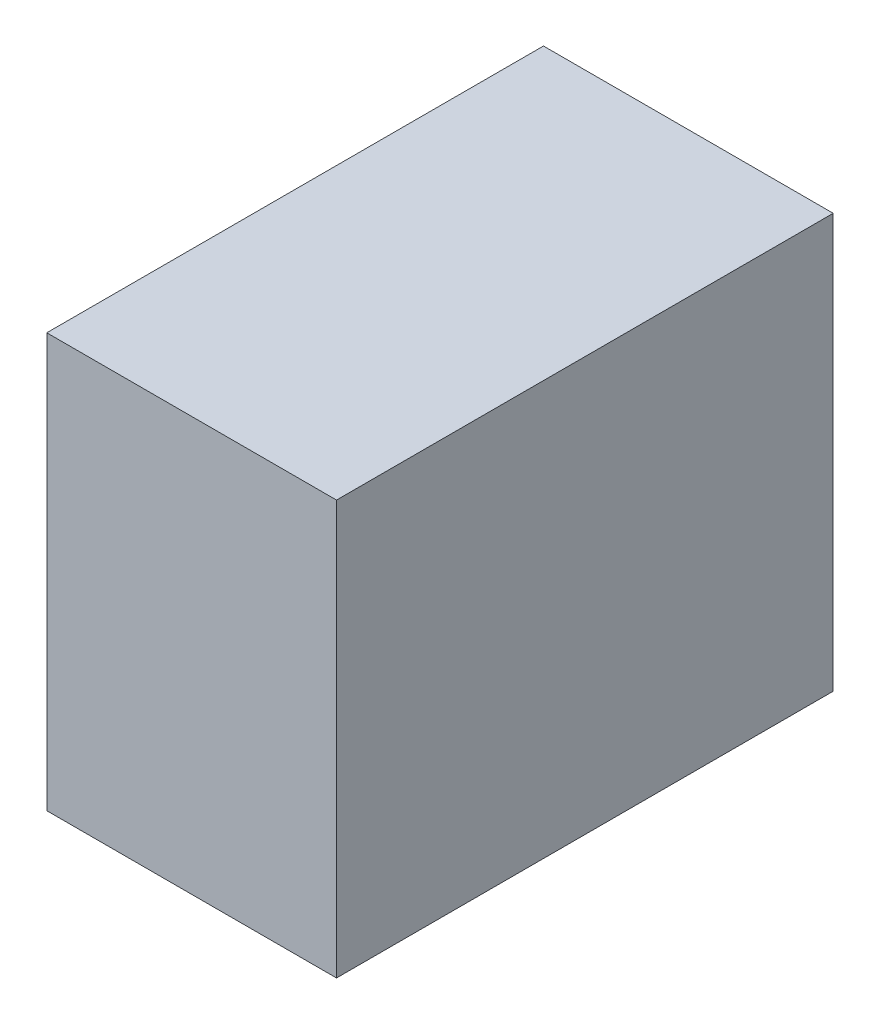
ISO-10303-21;
HEADER;
FILE_DESCRIPTION(('STEP AP214'),'2;1');
FILE_NAME('part.step','',(''),(''),'','','');
FILE_SCHEMA(('AUTOMOTIVE_DESIGN { 1 0 10303 214 1 1 1 1 }'));
ENDSEC;
DATA;
#1=APPLICATION_CONTEXT('core data for automotive mechanical design processes');
#2=APPLICATION_PROTOCOL_DEFINITION('international standard','automotive_design',2000,#1);
#3=PRODUCT_CONTEXT('',#1,'mechanical');
#4=PRODUCT('Part','Part','',(#3));
#5=PRODUCT_RELATED_PRODUCT_CATEGORY('part','',(#4));
#6=PRODUCT_DEFINITION_FORMATION('','',#4);
#7=PRODUCT_DEFINITION_CONTEXT('part definition',#1,'design');
#8=PRODUCT_DEFINITION('design','',#6,#7);
#9=PRODUCT_DEFINITION_SHAPE('','',#8);
#10=(LENGTH_UNIT() NAMED_UNIT(*) SI_UNIT(.MILLI.,.METRE.));
#11=(NAMED_UNIT(*) PLANE_ANGLE_UNIT() SI_UNIT($,.RADIAN.));
#12=(NAMED_UNIT(*) SI_UNIT($,.STERADIAN.) SOLID_ANGLE_UNIT());
#13=UNCERTAINTY_MEASURE_WITH_UNIT(LENGTH_MEASURE(1.E-05),#10,'distance_accuracy_value','');
#14=(GEOMETRIC_REPRESENTATION_CONTEXT(3) GLOBAL_UNCERTAINTY_ASSIGNED_CONTEXT((#13)) GLOBAL_UNIT_ASSIGNED_CONTEXT((#10,
#11,#12)) REPRESENTATION_CONTEXT('',''));
#15=CARTESIAN_POINT('',(0.,0.,0.));
#16=DIRECTION('',(0.,0.,1.));
#17=DIRECTION('',(1.,0.,0.));
#18=AXIS2_PLACEMENT_3D('',#15,#16,#17);
#19=CARTESIAN_POINT('',(-88.9,-127.,304.8));
#20=DIRECTION('',(1.,0.,0.));
#21=DIRECTION('',(0.,0.,-1.));
#22=AXIS2_PLACEMENT_3D('',#19,#20,#21);
#23=PLANE('',#22);
#24=DIRECTION('',(0.,-1.,0.));
#25=VECTOR('',#24,1.);
#26=CARTESIAN_POINT('',(-88.9,-127.,0.));
#27=LINE('',#26,#25);
#28=CARTESIAN_POINT('',(-88.9,127.,0.));
#29=VERTEX_POINT('',#28);
#30=CARTESIAN_POINT('',(-88.9,-127.,0.));
#31=VERTEX_POINT('',#30);
#32=EDGE_CURVE('E113',#29,#31,#27,.T.);
#33=ORIENTED_EDGE('',*,*,#32,.T.);
#34=DIRECTION('',(0.,0.,-1.));
#35=VECTOR('',#34,1.);
#36=CARTESIAN_POINT('',(-88.9,-127.,304.8));
#37=LINE('',#36,#35);
#38=CARTESIAN_POINT('',(-88.9,-127.,304.8));
#39=VERTEX_POINT('',#38);
#40=EDGE_CURVE('E11',#39,#31,#37,.T.);
#41=ORIENTED_EDGE('',*,*,#40,.F.);
#42=DIRECTION('',(0.,-1.,0.));
#43=VECTOR('',#42,1.);
#44=CARTESIAN_POINT('',(-88.9,-127.,304.8));
#45=LINE('',#44,#43);
#46=CARTESIAN_POINT('',(-88.9,127.,304.8));
#47=VERTEX_POINT('',#46);
#48=EDGE_CURVE('E97',#47,#39,#45,.T.);
#49=ORIENTED_EDGE('',*,*,#48,.F.);
#50=DIRECTION('',(0.,0.,-1.));
#51=VECTOR('',#50,1.);
#52=CARTESIAN_POINT('',(-88.9,127.,304.8));
#53=LINE('',#52,#51);
#54=EDGE_CURVE('E109',#47,#29,#53,.T.);
#55=ORIENTED_EDGE('',*,*,#54,.T.);
#56=EDGE_LOOP('',(#33,#41,#49,#55));
#57=FACE_BOUND('',#56,.T.);
#58=ADVANCED_FACE('F45',(#57),#23,.F.);
#59=CARTESIAN_POINT('',(88.9,-127.,304.8));
#60=DIRECTION('',(0.,1.,0.));
#61=DIRECTION('',(-1.,0.,0.));
#62=AXIS2_PLACEMENT_3D('',#59,#60,#61);
#63=PLANE('',#62);
#64=DIRECTION('',(1.,0.,0.));
#65=VECTOR('',#64,1.);
#66=CARTESIAN_POINT('',(88.9,-127.,0.));
#67=LINE('',#66,#65);
#68=CARTESIAN_POINT('',(88.9,-127.,0.));
#69=VERTEX_POINT('',#68);
#70=EDGE_CURVE('E102',#31,#69,#67,.T.);
#71=ORIENTED_EDGE('',*,*,#70,.T.);
#72=DIRECTION('',(0.,0.,-1.));
#73=VECTOR('',#72,1.);
#74=CARTESIAN_POINT('',(88.9,-127.,304.8));
#75=LINE('',#74,#73);
#76=CARTESIAN_POINT('',(88.9,-127.,304.8));
#77=VERTEX_POINT('',#76);
#78=EDGE_CURVE('E54',#77,#69,#75,.T.);
#79=ORIENTED_EDGE('',*,*,#78,.F.);
#80=DIRECTION('',(1.,0.,0.));
#81=VECTOR('',#80,1.);
#82=CARTESIAN_POINT('',(88.9,-127.,304.8));
#83=LINE('',#82,#81);
#84=EDGE_CURVE('E92',#39,#77,#83,.T.);
#85=ORIENTED_EDGE('',*,*,#84,.F.);
#86=ORIENTED_EDGE('',*,*,#40,.T.);
#87=EDGE_LOOP('',(#71,#79,#85,#86));
#88=FACE_BOUND('',#87,.T.);
#89=ADVANCED_FACE('F101',(#88),#63,.F.);
#90=CARTESIAN_POINT('',(88.9,-127.,304.8));
#91=DIRECTION('',(-1.,0.,0.));
#92=DIRECTION('',(0.,0.,1.));
#93=AXIS2_PLACEMENT_3D('',#90,#91,#92);
#94=PLANE('',#93);
#95=DIRECTION('',(0.,1.,0.));
#96=VECTOR('',#95,1.);
#97=CARTESIAN_POINT('',(88.9,-127.,0.));
#98=LINE('',#97,#96);
#99=CARTESIAN_POINT('',(88.9,127.,0.));
#100=VERTEX_POINT('',#99);
#101=EDGE_CURVE('E79',#69,#100,#98,.T.);
#102=ORIENTED_EDGE('',*,*,#101,.T.);
#103=DIRECTION('',(0.,0.,-1.));
#104=VECTOR('',#103,1.);
#105=CARTESIAN_POINT('',(88.9,127.,304.8));
#106=LINE('',#105,#104);
#107=CARTESIAN_POINT('',(88.9,127.,304.8));
#108=VERTEX_POINT('',#107);
#109=EDGE_CURVE('E104',#108,#100,#106,.T.);
#110=ORIENTED_EDGE('',*,*,#109,.F.);
#111=DIRECTION('',(0.,1.,0.));
#112=VECTOR('',#111,1.);
#113=CARTESIAN_POINT('',(88.9,-127.,304.8));
#114=LINE('',#113,#112);
#115=EDGE_CURVE('E95',#77,#108,#114,.T.);
#116=ORIENTED_EDGE('',*,*,#115,.F.);
#117=ORIENTED_EDGE('',*,*,#78,.T.);
#118=EDGE_LOOP('',(#102,#110,#116,#117));
#119=FACE_BOUND('',#118,.T.);
#120=ADVANCED_FACE('F105',(#119),#94,.F.);
#121=CARTESIAN_POINT('',(88.9,127.,304.8));
#122=DIRECTION('',(0.,-1.,0.));
#123=DIRECTION('',(1.,0.,0.));
#124=AXIS2_PLACEMENT_3D('',#121,#122,#123);
#125=PLANE('',#124);
#126=DIRECTION('',(-1.,0.,0.));
#127=VECTOR('',#126,1.);
#128=CARTESIAN_POINT('',(88.9,127.,0.));
#129=LINE('',#128,#127);
#130=EDGE_CURVE('E85',#100,#29,#129,.T.);
#131=ORIENTED_EDGE('',*,*,#130,.T.);
#132=ORIENTED_EDGE('',*,*,#54,.F.);
#133=DIRECTION('',(-1.,0.,0.));
#134=VECTOR('',#133,1.);
#135=CARTESIAN_POINT('',(88.9,127.,304.8));
#136=LINE('',#135,#134);
#137=EDGE_CURVE('E62',#108,#47,#136,.T.);
#138=ORIENTED_EDGE('',*,*,#137,.F.);
#139=ORIENTED_EDGE('',*,*,#109,.T.);
#140=EDGE_LOOP('',(#131,#132,#138,#139));
#141=FACE_BOUND('',#140,.T.);
#142=ADVANCED_FACE('F126',(#141),#125,.F.);
#143=CARTESIAN_POINT('',(0.,0.,304.8));
#144=DIRECTION('',(0.,0.,1.));
#145=DIRECTION('',(1.,0.,0.));
#146=AXIS2_PLACEMENT_3D('',#143,#144,#145);
#147=PLANE('',#146);
#148=ORIENTED_EDGE('',*,*,#48,.T.);
#149=ORIENTED_EDGE('',*,*,#84,.T.);
#150=ORIENTED_EDGE('',*,*,#115,.T.);
#151=ORIENTED_EDGE('',*,*,#137,.T.);
#152=EDGE_LOOP('',(#148,#149,#150,#151));
#153=FACE_BOUND('',#152,.T.);
#154=ADVANCED_FACE('F93',(#153),#147,.T.);
#155=CARTESIAN_POINT('',(0.,0.,0.));
#156=DIRECTION('',(0.,0.,1.));
#157=DIRECTION('',(1.,0.,0.));
#158=AXIS2_PLACEMENT_3D('',#155,#156,#157);
#159=PLANE('',#158);
#160=ORIENTED_EDGE('',*,*,#32,.F.);
#161=ORIENTED_EDGE('',*,*,#130,.F.);
#162=ORIENTED_EDGE('',*,*,#101,.F.);
#163=ORIENTED_EDGE('',*,*,#70,.F.);
#164=EDGE_LOOP('',(#160,#161,#162,#163));
#165=FACE_BOUND('',#164,.T.);
#166=ADVANCED_FACE('F129',(#165),#159,.F.);
#167=CLOSED_SHELL('',(#58,#89,#120,#142,#154,#166));
#168=MANIFOLD_SOLID_BREP('B2',#167);
#169=ADVANCED_BREP_SHAPE_REPRESENTATION('',(#18,#168),#14);
#170=SHAPE_DEFINITION_REPRESENTATION(#9,#169);
ENDSEC;
END-ISO-10303-21;
